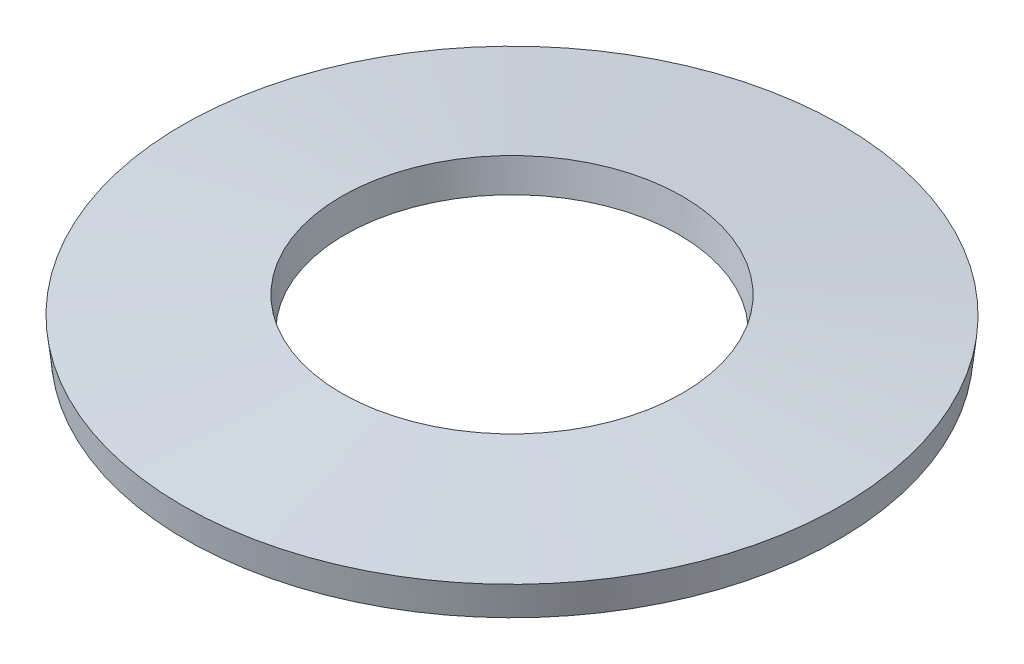
ISO-10303-21;
HEADER;
FILE_DESCRIPTION(('STEP AP214'),'2;1');
FILE_NAME('part.step','',(''),(''),'','','');
FILE_SCHEMA(('AUTOMOTIVE_DESIGN { 1 0 10303 214 1 1 1 1 }'));
ENDSEC;
DATA;
#1=APPLICATION_CONTEXT('core data for automotive mechanical design processes');
#2=APPLICATION_PROTOCOL_DEFINITION('international standard','automotive_design',2000,#1);
#3=PRODUCT_CONTEXT('',#1,'mechanical');
#4=PRODUCT('Part','Part','',(#3));
#5=PRODUCT_RELATED_PRODUCT_CATEGORY('part','',(#4));
#6=PRODUCT_DEFINITION_FORMATION('','',#4);
#7=PRODUCT_DEFINITION_CONTEXT('part definition',#1,'design');
#8=PRODUCT_DEFINITION('design','',#6,#7);
#9=PRODUCT_DEFINITION_SHAPE('','',#8);
#10=(LENGTH_UNIT() NAMED_UNIT(*) SI_UNIT(.MILLI.,.METRE.));
#11=(NAMED_UNIT(*) PLANE_ANGLE_UNIT() SI_UNIT($,.RADIAN.));
#12=(NAMED_UNIT(*) SI_UNIT($,.STERADIAN.) SOLID_ANGLE_UNIT());
#13=UNCERTAINTY_MEASURE_WITH_UNIT(LENGTH_MEASURE(1.E-05),#10,'distance_accuracy_value','');
#14=(GEOMETRIC_REPRESENTATION_CONTEXT(3) GLOBAL_UNCERTAINTY_ASSIGNED_CONTEXT((#13)) GLOBAL_UNIT_ASSIGNED_CONTEXT((#10,
#11,#12)) REPRESENTATION_CONTEXT('',''));
#15=CARTESIAN_POINT('',(0.,0.,0.));
#16=DIRECTION('',(0.,0.,1.));
#17=DIRECTION('',(1.,0.,0.));
#18=AXIS2_PLACEMENT_3D('',#15,#16,#17);
#19=CARTESIAN_POINT('',(0.,0.,0.));
#20=DIRECTION('',(0.,1.,0.));
#21=DIRECTION('',(0.,0.,1.));
#22=AXIS2_PLACEMENT_3D('',#19,#20,#21);
#23=CONICAL_SURFACE('',#22,4.71173500581563,0.111263971972544);
#24=CARTESIAN_POINT('',(0.,0.454372925431808,0.));
#25=DIRECTION('',(0.,-1.,0.));
#26=DIRECTION('',(0.,0.,-1.));
#27=AXIS2_PLACEMENT_3D('',#24,#25,#26);
#28=CIRCLE('',#27,4.7625);
#29=CARTESIAN_POINT('',(0.,0.454372925431808,-4.7625));
#30=VERTEX_POINT('',#29);
#31=EDGE_CURVE('E10',#30,#30,#28,.T.);
#32=ORIENTED_EDGE('',*,*,#31,.T.);
#33=EDGE_LOOP('',(#32));
#34=FACE_BOUND('',#33,.T.);
#35=CARTESIAN_POINT('',(0.,0.,0.));
#36=DIRECTION('',(0.,-1.,0.));
#37=DIRECTION('',(0.,0.,-1.));
#38=AXIS2_PLACEMENT_3D('',#35,#36,#37);
#39=CIRCLE('',#38,4.71173500581563);
#40=CARTESIAN_POINT('',(0.,0.,-4.71173500581563));
#41=VERTEX_POINT('',#40);
#42=EDGE_CURVE('E50',#41,#41,#39,.T.);
#43=ORIENTED_EDGE('',*,*,#42,.F.);
#44=EDGE_LOOP('',(#43));
#45=FACE_BOUND('',#44,.T.);
#46=ADVANCED_FACE('F36',(#34,#45),#23,.T.);
#47=CARTESIAN_POINT('',(0.,0.454372925431808,0.));
#48=DIRECTION('',(0.,-1.,0.));
#49=DIRECTION('',(0.,0.,-1.));
#50=AXIS2_PLACEMENT_3D('',#47,#48,#49);
#51=CONICAL_SURFACE('',#50,4.7625,1.45953235482235);
#52=CARTESIAN_POINT('',(0.,0.711199999999999,0.));
#53=DIRECTION('',(0.,-1.,0.));
#54=DIRECTION('',(0.,0.,-1.));
#55=AXIS2_PLACEMENT_3D('',#52,#53,#54);
#56=CIRCLE('',#55,2.46376499418437);
#57=CARTESIAN_POINT('',(0.,0.711199999999999,-2.46376499418437));
#58=VERTEX_POINT('',#57);
#59=EDGE_CURVE('E42',#58,#58,#56,.T.);
#60=ORIENTED_EDGE('',*,*,#59,.T.);
#61=EDGE_LOOP('',(#60));
#62=FACE_BOUND('',#61,.T.);
#63=ORIENTED_EDGE('',*,*,#31,.F.);
#64=EDGE_LOOP('',(#63));
#65=FACE_BOUND('',#64,.T.);
#66=ADVANCED_FACE('F60',(#62,#65),#51,.T.);
#67=CARTESIAN_POINT('',(0.,0.711199999999999,0.));
#68=DIRECTION('',(0.,1.,0.));
#69=DIRECTION('',(0.,0.,1.));
#70=AXIS2_PLACEMENT_3D('',#67,#68,#69);
#71=CONICAL_SURFACE('',#70,2.46376499418437,0.111263971972536);
#72=CARTESIAN_POINT('',(0.,0.256827074568189,0.));
#73=DIRECTION('',(0.,-1.,0.));
#74=DIRECTION('',(0.,0.,-1.));
#75=AXIS2_PLACEMENT_3D('',#72,#73,#74);
#76=CIRCLE('',#75,2.413);
#77=CARTESIAN_POINT('',(0.,0.256827074568189,-2.413));
#78=VERTEX_POINT('',#77);
#79=EDGE_CURVE('E46',#78,#78,#76,.T.);
#80=ORIENTED_EDGE('',*,*,#79,.T.);
#81=EDGE_LOOP('',(#80));
#82=FACE_BOUND('',#81,.T.);
#83=ORIENTED_EDGE('',*,*,#59,.F.);
#84=EDGE_LOOP('',(#83));
#85=FACE_BOUND('',#84,.T.);
#86=ADVANCED_FACE('F64',(#82,#85),#71,.F.);
#87=CARTESIAN_POINT('',(0.,0.256827074568189,0.));
#88=DIRECTION('',(0.,-1.,0.));
#89=DIRECTION('',(0.,0.,-1.));
#90=AXIS2_PLACEMENT_3D('',#87,#88,#89);
#91=CONICAL_SURFACE('',#90,2.413,1.45953235482235);
#92=ORIENTED_EDGE('',*,*,#42,.T.);
#93=EDGE_LOOP('',(#92));
#94=FACE_BOUND('',#93,.T.);
#95=ORIENTED_EDGE('',*,*,#79,.F.);
#96=EDGE_LOOP('',(#95));
#97=FACE_BOUND('',#96,.T.);
#98=ADVANCED_FACE('F56',(#94,#97),#91,.F.);
#99=CLOSED_SHELL('',(#46,#66,#86,#98));
#100=MANIFOLD_SOLID_BREP('B2',#99);
#101=ADVANCED_BREP_SHAPE_REPRESENTATION('',(#18,#100),#14);
#102=SHAPE_DEFINITION_REPRESENTATION(#9,#101);
ENDSEC;
END-ISO-10303-21;
